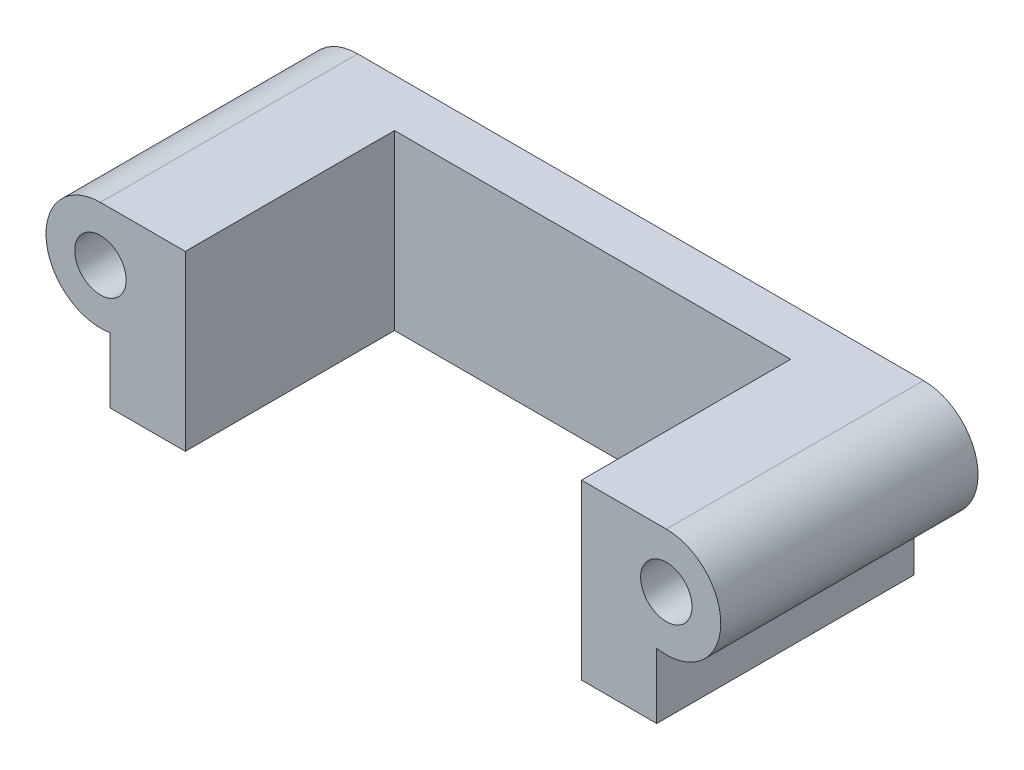
ISO-10303-21;
HEADER;
FILE_DESCRIPTION(('STEP AP214'),'2;1');
FILE_NAME('part.step','',(''),(''),'','','');
FILE_SCHEMA(('AUTOMOTIVE_DESIGN { 1 0 10303 214 1 1 1 1 }'));
ENDSEC;
DATA;
#1=APPLICATION_CONTEXT('core data for automotive mechanical design processes');
#2=APPLICATION_PROTOCOL_DEFINITION('international standard','automotive_design',2000,#1);
#3=PRODUCT_CONTEXT('',#1,'mechanical');
#4=PRODUCT('Part','Part','',(#3));
#5=PRODUCT_RELATED_PRODUCT_CATEGORY('part','',(#4));
#6=PRODUCT_DEFINITION_FORMATION('','',#4);
#7=PRODUCT_DEFINITION_CONTEXT('part definition',#1,'design');
#8=PRODUCT_DEFINITION('design','',#6,#7);
#9=PRODUCT_DEFINITION_SHAPE('','',#8);
#10=(LENGTH_UNIT() NAMED_UNIT(*) SI_UNIT(.MILLI.,.METRE.));
#11=(NAMED_UNIT(*) PLANE_ANGLE_UNIT() SI_UNIT($,.RADIAN.));
#12=(NAMED_UNIT(*) SI_UNIT($,.STERADIAN.) SOLID_ANGLE_UNIT());
#13=UNCERTAINTY_MEASURE_WITH_UNIT(LENGTH_MEASURE(1.E-05),#10,'distance_accuracy_value','');
#14=(GEOMETRIC_REPRESENTATION_CONTEXT(3) GLOBAL_UNCERTAINTY_ASSIGNED_CONTEXT((#13)) GLOBAL_UNIT_ASSIGNED_CONTEXT((#10,
#11,#12)) REPRESENTATION_CONTEXT('',''));
#15=CARTESIAN_POINT('',(0.,0.,0.));
#16=DIRECTION('',(0.,0.,1.));
#17=DIRECTION('',(1.,0.,0.));
#18=AXIS2_PLACEMENT_3D('',#15,#16,#17);
#19=CARTESIAN_POINT('',(0.,0.,15.));
#20=DIRECTION('',(0.,0.,1.));
#21=DIRECTION('',(1.,0.,0.));
#22=AXIS2_PLACEMENT_3D('',#19,#20,#21);
#23=PLANE('',#22);
#24=CARTESIAN_POINT('',(33.,0.,15.));
#25=DIRECTION('',(0.,0.,1.));
#26=DIRECTION('',(1.,0.,0.));
#27=AXIS2_PLACEMENT_3D('',#24,#25,#26);
#28=CIRCLE('',#27,1.5);
#29=CARTESIAN_POINT('',(34.5,0.,15.));
#30=VERTEX_POINT('',#29);
#31=EDGE_CURVE('E242',#30,#30,#28,.T.);
#32=ORIENTED_EDGE('',*,*,#31,.F.);
#33=EDGE_LOOP('',(#32));
#34=FACE_BOUND('',#33,.T.);
#35=DIRECTION('',(-1.,0.,0.));
#36=VECTOR('',#35,1.);
#37=CARTESIAN_POINT('',(0.,3.175,15.));
#38=LINE('',#37,#36);
#39=CARTESIAN_POINT('',(33.,3.175,15.));
#40=VERTEX_POINT('',#39);
#41=CARTESIAN_POINT('',(28.05,3.175,15.));
#42=VERTEX_POINT('',#41);
#43=EDGE_CURVE('E150',#40,#42,#38,.T.);
#44=ORIENTED_EDGE('',*,*,#43,.T.);
#45=DIRECTION('',(0.,-1.,0.));
#46=VECTOR('',#45,1.);
#47=CARTESIAN_POINT('',(28.05,3.175,15.));
#48=LINE('',#47,#46);
#49=CARTESIAN_POINT('',(28.05,-6.925,15.));
#50=VERTEX_POINT('',#49);
#51=EDGE_CURVE('E196',#42,#50,#48,.T.);
#52=ORIENTED_EDGE('',*,*,#51,.T.);
#53=DIRECTION('',(1.,0.,0.));
#54=VECTOR('',#53,1.);
#55=CARTESIAN_POINT('',(0.561248608016089,-6.925,15.));
#56=LINE('',#55,#54);
#57=CARTESIAN_POINT('',(32.4387513919839,-6.925,15.));
#58=VERTEX_POINT('',#57);
#59=EDGE_CURVE('E123',#50,#58,#56,.T.);
#60=ORIENTED_EDGE('',*,*,#59,.T.);
#61=DIRECTION('',(0.,1.,0.));
#62=VECTOR('',#61,1.);
#63=CARTESIAN_POINT('',(32.4387513919839,-6.925,15.));
#64=LINE('',#63,#62);
#65=CARTESIAN_POINT('',(32.4387513919839,-3.125,15.));
#66=VERTEX_POINT('',#65);
#67=EDGE_CURVE('E117',#58,#66,#64,.T.);
#68=ORIENTED_EDGE('',*,*,#67,.T.);
#69=CARTESIAN_POINT('',(33.,0.,15.));
#70=DIRECTION('',(0.,0.,1.));
#71=DIRECTION('',(1.,0.,0.));
#72=AXIS2_PLACEMENT_3D('',#69,#70,#71);
#73=CIRCLE('',#72,3.175);
#74=EDGE_CURVE('E118',#66,#40,#73,.T.);
#75=ORIENTED_EDGE('',*,*,#74,.T.);
#76=EDGE_LOOP('',(#44,#52,#60,#68,#75));
#77=FACE_BOUND('',#76,.T.);
#78=ADVANCED_FACE('F44',(#34,#77),#23,.T.);
#79=CARTESIAN_POINT('',(0.,3.175,15.));
#80=DIRECTION('',(0.,-1.,0.));
#81=DIRECTION('',(0.,0.,-1.));
#82=AXIS2_PLACEMENT_3D('',#79,#80,#81);
#83=PLANE('',#82);
#84=DIRECTION('',(0.,0.,1.));
#85=VECTOR('',#84,1.);
#86=CARTESIAN_POINT('',(4.95,3.175,15.));
#87=LINE('',#86,#85);
#88=CARTESIAN_POINT('',(4.95,3.175,2.8));
#89=VERTEX_POINT('',#88);
#90=CARTESIAN_POINT('',(4.95,3.175,15.));
#91=VERTEX_POINT('',#90);
#92=EDGE_CURVE('E218',#89,#91,#87,.T.);
#93=ORIENTED_EDGE('',*,*,#92,.F.);
#94=DIRECTION('',(-1.,0.,0.));
#95=VECTOR('',#94,1.);
#96=CARTESIAN_POINT('',(4.95,3.175,2.8));
#97=LINE('',#96,#95);
#98=CARTESIAN_POINT('',(28.05,3.175,2.8));
#99=VERTEX_POINT('',#98);
#100=EDGE_CURVE('E256',#99,#89,#97,.T.);
#101=ORIENTED_EDGE('',*,*,#100,.F.);
#102=DIRECTION('',(0.,0.,-1.));
#103=VECTOR('',#102,1.);
#104=CARTESIAN_POINT('',(28.05,3.175,15.));
#105=LINE('',#104,#103);
#106=EDGE_CURVE('E194',#42,#99,#105,.T.);
#107=ORIENTED_EDGE('',*,*,#106,.F.);
#108=ORIENTED_EDGE('',*,*,#43,.F.);
#109=DIRECTION('',(0.,0.,-1.));
#110=VECTOR('',#109,1.);
#111=CARTESIAN_POINT('',(33.,3.175,15.));
#112=LINE('',#111,#110);
#113=CARTESIAN_POINT('',(33.,3.175,0.));
#114=VERTEX_POINT('',#113);
#115=EDGE_CURVE('E139',#40,#114,#112,.T.);
#116=ORIENTED_EDGE('',*,*,#115,.T.);
#117=DIRECTION('',(-1.,0.,0.));
#118=VECTOR('',#117,1.);
#119=CARTESIAN_POINT('',(0.,3.175,0.));
#120=LINE('',#119,#118);
#121=CARTESIAN_POINT('',(0.,3.175,0.));
#122=VERTEX_POINT('',#121);
#123=EDGE_CURVE('E98',#114,#122,#120,.T.);
#124=ORIENTED_EDGE('',*,*,#123,.T.);
#125=DIRECTION('',(0.,0.,-1.));
#126=VECTOR('',#125,1.);
#127=CARTESIAN_POINT('',(0.,3.175,15.));
#128=LINE('',#127,#126);
#129=CARTESIAN_POINT('',(0.,3.175,15.));
#130=VERTEX_POINT('',#129);
#131=EDGE_CURVE('E155',#130,#122,#128,.T.);
#132=ORIENTED_EDGE('',*,*,#131,.F.);
#133=EDGE_CURVE('E69',#91,#130,#38,.T.);
#134=ORIENTED_EDGE('',*,*,#133,.F.);
#135=EDGE_LOOP('',(#93,#101,#107,#108,#116,#124,#132,#134));
#136=FACE_BOUND('',#135,.T.);
#137=ADVANCED_FACE('F191',(#136),#83,.F.);
#138=DIRECTION('',(0.,-1.,0.));
#139=VECTOR('',#138,1.);
#140=CARTESIAN_POINT('',(4.95,3.175,15.));
#141=LINE('',#140,#139);
#142=CARTESIAN_POINT('',(4.95,-6.925,15.));
#143=VERTEX_POINT('',#142);
#144=EDGE_CURVE('E214',#91,#143,#141,.T.);
#145=ORIENTED_EDGE('',*,*,#144,.F.);
#146=ORIENTED_EDGE('',*,*,#133,.T.);
#147=CARTESIAN_POINT('',(0.,0.,15.));
#148=DIRECTION('',(0.,0.,1.));
#149=DIRECTION('',(1.,0.,0.));
#150=AXIS2_PLACEMENT_3D('',#147,#148,#149);
#151=CIRCLE('',#150,3.175);
#152=CARTESIAN_POINT('',(0.561248608016089,-3.125,15.));
#153=VERTEX_POINT('',#152);
#154=EDGE_CURVE('E172',#130,#153,#151,.T.);
#155=ORIENTED_EDGE('',*,*,#154,.T.);
#156=DIRECTION('',(0.,-1.,0.));
#157=VECTOR('',#156,1.);
#158=CARTESIAN_POINT('',(0.561248608016089,-6.925,15.));
#159=LINE('',#158,#157);
#160=CARTESIAN_POINT('',(0.561248608016089,-6.925,15.));
#161=VERTEX_POINT('',#160);
#162=EDGE_CURVE('E106',#153,#161,#159,.T.);
#163=ORIENTED_EDGE('',*,*,#162,.T.);
#164=EDGE_CURVE('E129',#161,#143,#56,.T.);
#165=ORIENTED_EDGE('',*,*,#164,.T.);
#166=EDGE_LOOP('',(#145,#146,#155,#163,#165));
#167=FACE_BOUND('',#166,.T.);
#168=CARTESIAN_POINT('',(0.,0.,15.));
#169=DIRECTION('',(0.,0.,1.));
#170=DIRECTION('',(1.,0.,0.));
#171=AXIS2_PLACEMENT_3D('',#168,#169,#170);
#172=CIRCLE('',#171,1.5);
#173=CARTESIAN_POINT('',(1.5,0.,15.));
#174=VERTEX_POINT('',#173);
#175=EDGE_CURVE('E158',#174,#174,#172,.T.);
#176=ORIENTED_EDGE('',*,*,#175,.F.);
#177=EDGE_LOOP('',(#176));
#178=FACE_BOUND('',#177,.T.);
#179=ADVANCED_FACE('F229',(#167,#178),#23,.T.);
#180=CARTESIAN_POINT('',(0.,0.,0.));
#181=DIRECTION('',(0.,0.,1.));
#182=DIRECTION('',(1.,0.,0.));
#183=AXIS2_PLACEMENT_3D('',#180,#181,#182);
#184=PLANE('',#183);
#185=CARTESIAN_POINT('',(0.,0.,0.));
#186=DIRECTION('',(0.,0.,1.));
#187=DIRECTION('',(1.,0.,0.));
#188=AXIS2_PLACEMENT_3D('',#185,#186,#187);
#189=CIRCLE('',#188,3.175);
#190=CARTESIAN_POINT('',(0.561248608016089,-3.125,0.));
#191=VERTEX_POINT('',#190);
#192=EDGE_CURVE('E153',#122,#191,#189,.T.);
#193=ORIENTED_EDGE('',*,*,#192,.F.);
#194=ORIENTED_EDGE('',*,*,#123,.F.);
#195=CARTESIAN_POINT('',(33.,0.,0.));
#196=DIRECTION('',(0.,0.,1.));
#197=DIRECTION('',(1.,0.,0.));
#198=AXIS2_PLACEMENT_3D('',#195,#196,#197);
#199=CIRCLE('',#198,3.175);
#200=CARTESIAN_POINT('',(32.4387513919839,-3.125,0.));
#201=VERTEX_POINT('',#200);
#202=EDGE_CURVE('E167',#201,#114,#199,.T.);
#203=ORIENTED_EDGE('',*,*,#202,.F.);
#204=DIRECTION('',(0.,1.,0.));
#205=VECTOR('',#204,1.);
#206=CARTESIAN_POINT('',(32.4387513919839,-6.925,0.));
#207=LINE('',#206,#205);
#208=CARTESIAN_POINT('',(32.4387513919839,-6.925,0.));
#209=VERTEX_POINT('',#208);
#210=EDGE_CURVE('E133',#209,#201,#207,.T.);
#211=ORIENTED_EDGE('',*,*,#210,.F.);
#212=DIRECTION('',(1.,0.,0.));
#213=VECTOR('',#212,1.);
#214=CARTESIAN_POINT('',(0.561248608016089,-6.925,0.));
#215=LINE('',#214,#213);
#216=CARTESIAN_POINT('',(0.561248608016089,-6.925,0.));
#217=VERTEX_POINT('',#216);
#218=EDGE_CURVE('E161',#217,#209,#215,.T.);
#219=ORIENTED_EDGE('',*,*,#218,.F.);
#220=DIRECTION('',(0.,-1.,0.));
#221=VECTOR('',#220,1.);
#222=CARTESIAN_POINT('',(0.561248608016089,-6.925,0.));
#223=LINE('',#222,#221);
#224=EDGE_CURVE('E160',#191,#217,#223,.T.);
#225=ORIENTED_EDGE('',*,*,#224,.F.);
#226=EDGE_LOOP('',(#193,#194,#203,#211,#219,#225));
#227=FACE_BOUND('',#226,.T.);
#228=CARTESIAN_POINT('',(0.,0.,0.));
#229=DIRECTION('',(0.,0.,1.));
#230=DIRECTION('',(1.,0.,0.));
#231=AXIS2_PLACEMENT_3D('',#228,#229,#230);
#232=CIRCLE('',#231,1.5);
#233=CARTESIAN_POINT('',(1.5,0.,0.));
#234=VERTEX_POINT('',#233);
#235=EDGE_CURVE('E240',#234,#234,#232,.T.);
#236=ORIENTED_EDGE('',*,*,#235,.T.);
#237=EDGE_LOOP('',(#236));
#238=FACE_BOUND('',#237,.T.);
#239=CARTESIAN_POINT('',(33.,0.,0.));
#240=DIRECTION('',(0.,0.,1.));
#241=DIRECTION('',(1.,0.,0.));
#242=AXIS2_PLACEMENT_3D('',#239,#240,#241);
#243=CIRCLE('',#242,1.5);
#244=CARTESIAN_POINT('',(34.5,0.,0.));
#245=VERTEX_POINT('',#244);
#246=EDGE_CURVE('E222',#245,#245,#243,.T.);
#247=ORIENTED_EDGE('',*,*,#246,.T.);
#248=EDGE_LOOP('',(#247));
#249=FACE_BOUND('',#248,.T.);
#250=ADVANCED_FACE('F189',(#227,#238,#249),#184,.F.);
#251=CARTESIAN_POINT('',(0.,0.,15.));
#252=DIRECTION('',(0.,0.,-1.));
#253=DIRECTION('',(-1.,0.,0.));
#254=AXIS2_PLACEMENT_3D('',#251,#252,#253);
#255=CYLINDRICAL_SURFACE('',#254,3.175);
#256=ORIENTED_EDGE('',*,*,#192,.T.);
#257=DIRECTION('',(0.,0.,-1.));
#258=VECTOR('',#257,1.);
#259=CARTESIAN_POINT('',(0.561248608016089,-3.125,15.));
#260=LINE('',#259,#258);
#261=EDGE_CURVE('E11',#153,#191,#260,.T.);
#262=ORIENTED_EDGE('',*,*,#261,.F.);
#263=ORIENTED_EDGE('',*,*,#154,.F.);
#264=ORIENTED_EDGE('',*,*,#131,.T.);
#265=EDGE_LOOP('',(#256,#262,#263,#264));
#266=FACE_BOUND('',#265,.T.);
#267=ADVANCED_FACE('F50',(#266),#255,.T.);
#268=CARTESIAN_POINT('',(0.561248608016089,-6.925,15.));
#269=DIRECTION('',(1.,0.,0.));
#270=DIRECTION('',(0.,0.,-1.));
#271=AXIS2_PLACEMENT_3D('',#268,#269,#270);
#272=PLANE('',#271);
#273=ORIENTED_EDGE('',*,*,#224,.T.);
#274=DIRECTION('',(0.,0.,-1.));
#275=VECTOR('',#274,1.);
#276=CARTESIAN_POINT('',(0.561248608016089,-6.925,15.));
#277=LINE('',#276,#275);
#278=EDGE_CURVE('E53',#161,#217,#277,.T.);
#279=ORIENTED_EDGE('',*,*,#278,.F.);
#280=ORIENTED_EDGE('',*,*,#162,.F.);
#281=ORIENTED_EDGE('',*,*,#261,.T.);
#282=EDGE_LOOP('',(#273,#279,#280,#281));
#283=FACE_BOUND('',#282,.T.);
#284=ADVANCED_FACE('F272',(#283),#272,.F.);
#285=CARTESIAN_POINT('',(0.561248608016089,-6.925,15.));
#286=DIRECTION('',(0.,1.,0.));
#287=DIRECTION('',(-1.,0.,0.));
#288=AXIS2_PLACEMENT_3D('',#285,#286,#287);
#289=PLANE('',#288);
#290=DIRECTION('',(-1.,0.,0.));
#291=VECTOR('',#290,1.);
#292=CARTESIAN_POINT('',(4.95,-6.925,2.8));
#293=LINE('',#292,#291);
#294=CARTESIAN_POINT('',(28.05,-6.925,2.8));
#295=VERTEX_POINT('',#294);
#296=CARTESIAN_POINT('',(4.95,-6.925,2.8));
#297=VERTEX_POINT('',#296);
#298=EDGE_CURVE('E221',#295,#297,#293,.T.);
#299=ORIENTED_EDGE('',*,*,#298,.T.);
#300=DIRECTION('',(0.,0.,1.));
#301=VECTOR('',#300,1.);
#302=CARTESIAN_POINT('',(4.95,-6.925,15.));
#303=LINE('',#302,#301);
#304=EDGE_CURVE('E217',#297,#143,#303,.T.);
#305=ORIENTED_EDGE('',*,*,#304,.T.);
#306=ORIENTED_EDGE('',*,*,#164,.F.);
#307=ORIENTED_EDGE('',*,*,#278,.T.);
#308=ORIENTED_EDGE('',*,*,#218,.T.);
#309=DIRECTION('',(0.,0.,-1.));
#310=VECTOR('',#309,1.);
#311=CARTESIAN_POINT('',(32.4387513919839,-6.925,15.));
#312=LINE('',#311,#310);
#313=EDGE_CURVE('E138',#58,#209,#312,.T.);
#314=ORIENTED_EDGE('',*,*,#313,.F.);
#315=ORIENTED_EDGE('',*,*,#59,.F.);
#316=DIRECTION('',(0.,0.,-1.));
#317=VECTOR('',#316,1.);
#318=CARTESIAN_POINT('',(28.05,-6.925,15.));
#319=LINE('',#318,#317);
#320=EDGE_CURVE('E227',#50,#295,#319,.T.);
#321=ORIENTED_EDGE('',*,*,#320,.T.);
#322=EDGE_LOOP('',(#299,#305,#306,#307,#308,#314,#315,#321));
#323=FACE_BOUND('',#322,.T.);
#324=ADVANCED_FACE('F181',(#323),#289,.F.);
#325=CARTESIAN_POINT('',(32.4387513919839,-6.925,15.));
#326=DIRECTION('',(-1.,0.,0.));
#327=DIRECTION('',(0.,0.,1.));
#328=AXIS2_PLACEMENT_3D('',#325,#326,#327);
#329=PLANE('',#328);
#330=ORIENTED_EDGE('',*,*,#210,.T.);
#331=DIRECTION('',(0.,0.,-1.));
#332=VECTOR('',#331,1.);
#333=CARTESIAN_POINT('',(32.4387513919839,-3.125,15.));
#334=LINE('',#333,#332);
#335=EDGE_CURVE('E135',#66,#201,#334,.T.);
#336=ORIENTED_EDGE('',*,*,#335,.F.);
#337=ORIENTED_EDGE('',*,*,#67,.F.);
#338=ORIENTED_EDGE('',*,*,#313,.T.);
#339=EDGE_LOOP('',(#330,#336,#337,#338));
#340=FACE_BOUND('',#339,.T.);
#341=ADVANCED_FACE('F134',(#340),#329,.F.);
#342=CARTESIAN_POINT('',(33.,0.,15.));
#343=DIRECTION('',(0.,0.,-1.));
#344=DIRECTION('',(-1.,0.,0.));
#345=AXIS2_PLACEMENT_3D('',#342,#343,#344);
#346=CYLINDRICAL_SURFACE('',#345,3.175);
#347=ORIENTED_EDGE('',*,*,#202,.T.);
#348=ORIENTED_EDGE('',*,*,#115,.F.);
#349=ORIENTED_EDGE('',*,*,#74,.F.);
#350=ORIENTED_EDGE('',*,*,#335,.T.);
#351=EDGE_LOOP('',(#347,#348,#349,#350));
#352=FACE_BOUND('',#351,.T.);
#353=ADVANCED_FACE('F142',(#352),#346,.T.);
#354=CARTESIAN_POINT('',(0.,0.,15.));
#355=DIRECTION('',(0.,0.,-1.));
#356=DIRECTION('',(-1.,0.,0.));
#357=AXIS2_PLACEMENT_3D('',#354,#355,#356);
#358=CYLINDRICAL_SURFACE('',#357,1.5);
#359=ORIENTED_EDGE('',*,*,#175,.T.);
#360=EDGE_LOOP('',(#359));
#361=FACE_BOUND('',#360,.T.);
#362=ORIENTED_EDGE('',*,*,#235,.F.);
#363=EDGE_LOOP('',(#362));
#364=FACE_BOUND('',#363,.T.);
#365=ADVANCED_FACE('F301',(#361,#364),#358,.F.);
#366=CARTESIAN_POINT('',(33.,0.,15.));
#367=DIRECTION('',(0.,0.,-1.));
#368=DIRECTION('',(-1.,0.,0.));
#369=AXIS2_PLACEMENT_3D('',#366,#367,#368);
#370=CYLINDRICAL_SURFACE('',#369,1.5);
#371=ORIENTED_EDGE('',*,*,#31,.T.);
#372=EDGE_LOOP('',(#371));
#373=FACE_BOUND('',#372,.T.);
#374=ORIENTED_EDGE('',*,*,#246,.F.);
#375=EDGE_LOOP('',(#374));
#376=FACE_BOUND('',#375,.T.);
#377=ADVANCED_FACE('F316',(#373,#376),#370,.F.);
#378=CARTESIAN_POINT('',(4.95,3.175,15.));
#379=DIRECTION('',(1.,0.,0.));
#380=DIRECTION('',(0.,0.,-1.));
#381=AXIS2_PLACEMENT_3D('',#378,#379,#380);
#382=PLANE('',#381);
#383=DIRECTION('',(0.,-1.,0.));
#384=VECTOR('',#383,1.);
#385=CARTESIAN_POINT('',(4.95,3.175,2.8));
#386=LINE('',#385,#384);
#387=EDGE_CURVE('E254',#89,#297,#386,.T.);
#388=ORIENTED_EDGE('',*,*,#387,.F.);
#389=ORIENTED_EDGE('',*,*,#92,.T.);
#390=ORIENTED_EDGE('',*,*,#144,.T.);
#391=ORIENTED_EDGE('',*,*,#304,.F.);
#392=EDGE_LOOP('',(#388,#389,#390,#391));
#393=FACE_BOUND('',#392,.T.);
#394=ADVANCED_FACE('F220',(#393),#382,.T.);
#395=CARTESIAN_POINT('',(28.05,3.175,15.));
#396=DIRECTION('',(-1.,0.,0.));
#397=DIRECTION('',(0.,0.,1.));
#398=AXIS2_PLACEMENT_3D('',#395,#396,#397);
#399=PLANE('',#398);
#400=ORIENTED_EDGE('',*,*,#51,.F.);
#401=ORIENTED_EDGE('',*,*,#106,.T.);
#402=DIRECTION('',(0.,-1.,0.));
#403=VECTOR('',#402,1.);
#404=CARTESIAN_POINT('',(28.05,3.175,2.8));
#405=LINE('',#404,#403);
#406=EDGE_CURVE('E62',#99,#295,#405,.T.);
#407=ORIENTED_EDGE('',*,*,#406,.T.);
#408=ORIENTED_EDGE('',*,*,#320,.F.);
#409=EDGE_LOOP('',(#400,#401,#407,#408));
#410=FACE_BOUND('',#409,.T.);
#411=ADVANCED_FACE('F268',(#410),#399,.T.);
#412=CARTESIAN_POINT('',(4.95,3.175,2.8));
#413=DIRECTION('',(0.,0.,1.));
#414=DIRECTION('',(1.,0.,0.));
#415=AXIS2_PLACEMENT_3D('',#412,#413,#414);
#416=PLANE('',#415);
#417=ORIENTED_EDGE('',*,*,#406,.F.);
#418=ORIENTED_EDGE('',*,*,#100,.T.);
#419=ORIENTED_EDGE('',*,*,#387,.T.);
#420=ORIENTED_EDGE('',*,*,#298,.F.);
#421=EDGE_LOOP('',(#417,#418,#419,#420));
#422=FACE_BOUND('',#421,.T.);
#423=ADVANCED_FACE('F267',(#422),#416,.T.);
#424=CLOSED_SHELL('',(#78,#137,#179,#250,#267,#284,#324,#341,#353,#365,#377,#394,#411,#423));
#425=MANIFOLD_SOLID_BREP('B2',#424);
#426=ADVANCED_BREP_SHAPE_REPRESENTATION('',(#18,#425),#14);
#427=SHAPE_DEFINITION_REPRESENTATION(#9,#426);
ENDSEC;
END-ISO-10303-21;
